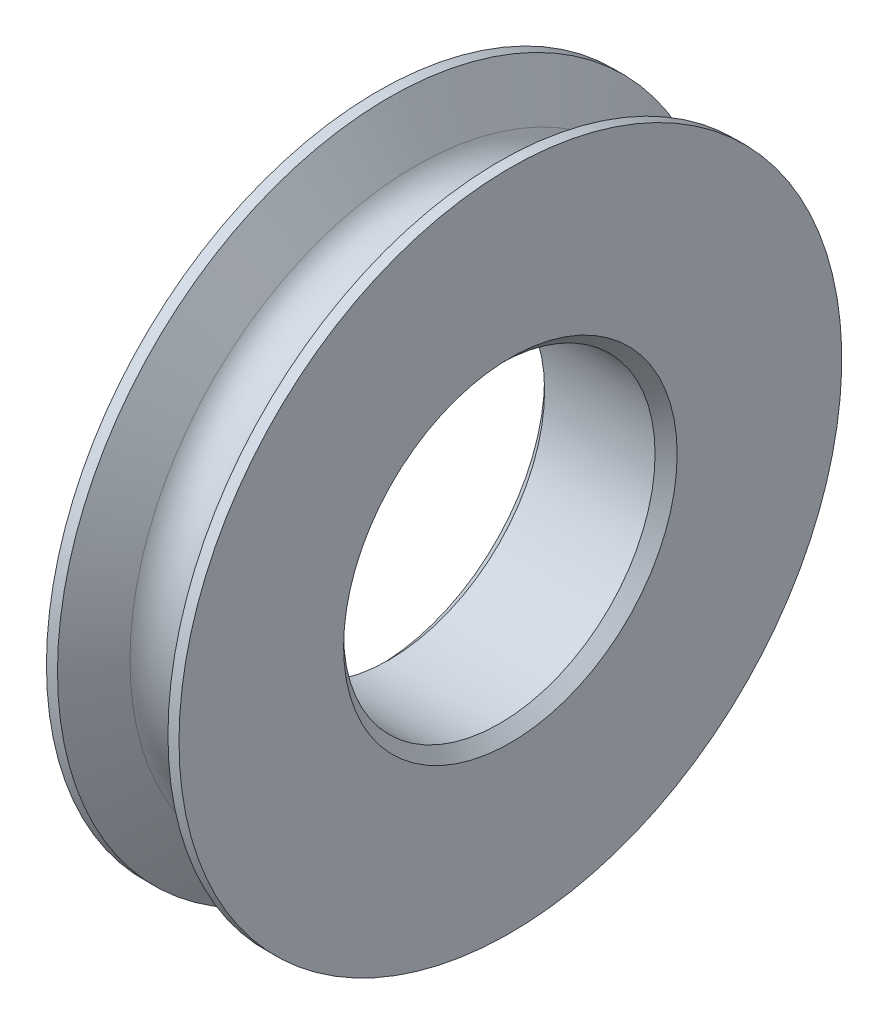
ISO-10303-21;
HEADER;
FILE_DESCRIPTION(('STEP AP214'),'2;1');
FILE_NAME('part.step','',(''),(''),'','','');
FILE_SCHEMA(('AUTOMOTIVE_DESIGN { 1 0 10303 214 1 1 1 1 }'));
ENDSEC;
DATA;
#1=APPLICATION_CONTEXT('core data for automotive mechanical design processes');
#2=APPLICATION_PROTOCOL_DEFINITION('international standard','automotive_design',2000,#1);
#3=PRODUCT_CONTEXT('',#1,'mechanical');
#4=PRODUCT('Part','Part','',(#3));
#5=PRODUCT_RELATED_PRODUCT_CATEGORY('part','',(#4));
#6=PRODUCT_DEFINITION_FORMATION('','',#4);
#7=PRODUCT_DEFINITION_CONTEXT('part definition',#1,'design');
#8=PRODUCT_DEFINITION('design','',#6,#7);
#9=PRODUCT_DEFINITION_SHAPE('','',#8);
#10=(LENGTH_UNIT() NAMED_UNIT(*) SI_UNIT(.MILLI.,.METRE.));
#11=(NAMED_UNIT(*) PLANE_ANGLE_UNIT() SI_UNIT($,.RADIAN.));
#12=(NAMED_UNIT(*) SI_UNIT($,.STERADIAN.) SOLID_ANGLE_UNIT());
#13=UNCERTAINTY_MEASURE_WITH_UNIT(LENGTH_MEASURE(1.E-05),#10,'distance_accuracy_value','');
#14=(GEOMETRIC_REPRESENTATION_CONTEXT(3) GLOBAL_UNCERTAINTY_ASSIGNED_CONTEXT((#13)) GLOBAL_UNIT_ASSIGNED_CONTEXT((#10,
#11,#12)) REPRESENTATION_CONTEXT('',''));
#15=CARTESIAN_POINT('',(0.,0.,0.));
#16=DIRECTION('',(0.,0.,1.));
#17=DIRECTION('',(1.,0.,0.));
#18=AXIS2_PLACEMENT_3D('',#15,#16,#17);
#19=CARTESIAN_POINT('',(3.,7.05,0.));
#20=DIRECTION('',(-1.,0.,0.));
#21=DIRECTION('',(0.,0.,1.));
#22=AXIS2_PLACEMENT_3D('',#19,#20,#21);
#23=PLANE('',#22);
#24=CARTESIAN_POINT('',(3.,0.,0.));
#25=DIRECTION('',(-1.,0.,0.));
#26=DIRECTION('',(0.,0.,1.));
#27=AXIS2_PLACEMENT_3D('',#24,#25,#26);
#28=CIRCLE('',#27,7.54999999999999);
#29=CARTESIAN_POINT('',(3.,0.,7.54999999999999));
#30=VERTEX_POINT('',#29);
#31=EDGE_CURVE('E57',#30,#30,#28,.T.);
#32=ORIENTED_EDGE('',*,*,#31,.T.);
#33=EDGE_LOOP('',(#32));
#34=FACE_BOUND('',#33,.T.);
#35=CARTESIAN_POINT('',(3.,0.,0.));
#36=DIRECTION('',(-1.,0.,0.));
#37=DIRECTION('',(0.,0.,1.));
#38=AXIS2_PLACEMENT_3D('',#35,#36,#37);
#39=CIRCLE('',#38,15.);
#40=CARTESIAN_POINT('',(3.,0.,15.));
#41=VERTEX_POINT('',#40);
#42=EDGE_CURVE('E62',#41,#41,#39,.T.);
#43=ORIENTED_EDGE('',*,*,#42,.F.);
#44=EDGE_LOOP('',(#43));
#45=FACE_BOUND('',#44,.T.);
#46=ADVANCED_FACE('F41',(#34,#45),#23,.F.);
#47=CARTESIAN_POINT('',(-10.2331083957926,0.,0.));
#48=DIRECTION('',(-1.,0.,0.));
#49=DIRECTION('',(0.,0.,1.));
#50=AXIS2_PLACEMENT_3D('',#47,#48,#49);
#51=CYLINDRICAL_SURFACE('',#50,15.);
#52=CARTESIAN_POINT('',(2.5,0.,0.));
#53=DIRECTION('',(-1.,0.,0.));
#54=DIRECTION('',(0.,0.,1.));
#55=AXIS2_PLACEMENT_3D('',#52,#53,#54);
#56=CIRCLE('',#55,15.);
#57=CARTESIAN_POINT('',(2.5,0.,15.));
#58=VERTEX_POINT('',#57);
#59=EDGE_CURVE('E65',#58,#58,#56,.T.);
#60=ORIENTED_EDGE('',*,*,#59,.F.);
#61=EDGE_LOOP('',(#60));
#62=FACE_BOUND('',#61,.T.);
#63=ORIENTED_EDGE('',*,*,#42,.T.);
#64=EDGE_LOOP('',(#63));
#65=FACE_BOUND('',#64,.T.);
#66=ADVANCED_FACE('F104',(#62,#65),#51,.T.);
#67=CARTESIAN_POINT('',(2.5,0.,0.));
#68=DIRECTION('',(1.,0.,0.));
#69=DIRECTION('',(0.,0.,-1.));
#70=AXIS2_PLACEMENT_3D('',#67,#68,#69);
#71=CONICAL_SURFACE('',#70,15.,1.0471975511966);
#72=CARTESIAN_POINT('',(1.29903810567666,0.,0.));
#73=DIRECTION('',(-1.,0.,0.));
#74=DIRECTION('',(0.,0.,1.));
#75=AXIS2_PLACEMENT_3D('',#72,#73,#74);
#76=CIRCLE('',#75,12.9198729810778);
#77=CARTESIAN_POINT('',(1.29903810567666,0.,12.9198729810778));
#78=VERTEX_POINT('',#77);
#79=EDGE_CURVE('E68',#78,#78,#76,.T.);
#80=ORIENTED_EDGE('',*,*,#79,.F.);
#81=EDGE_LOOP('',(#80));
#82=FACE_BOUND('',#81,.T.);
#83=ORIENTED_EDGE('',*,*,#59,.T.);
#84=EDGE_LOOP('',(#83));
#85=FACE_BOUND('',#84,.T.);
#86=ADVANCED_FACE('F98',(#82,#85),#71,.T.);
#87=CARTESIAN_POINT('',(0.,0.,0.));
#88=DIRECTION('',(-1.,0.,0.));
#89=DIRECTION('',(0.,0.,1.));
#90=AXIS2_PLACEMENT_3D('',#87,#88,#89);
#91=TOROIDAL_SURFACE('',#90,13.6698729810778,1.5);
#92=CARTESIAN_POINT('',(-1.29903810567666,0.,0.));
#93=DIRECTION('',(-1.,0.,0.));
#94=DIRECTION('',(0.,0.,1.));
#95=AXIS2_PLACEMENT_3D('',#92,#93,#94);
#96=CIRCLE('',#95,12.9198729810778);
#97=CARTESIAN_POINT('',(-1.29903810567666,0.,12.9198729810778));
#98=VERTEX_POINT('',#97);
#99=EDGE_CURVE('E71',#98,#98,#96,.T.);
#100=ORIENTED_EDGE('',*,*,#99,.F.);
#101=EDGE_LOOP('',(#100));
#102=FACE_BOUND('',#101,.T.);
#103=ORIENTED_EDGE('',*,*,#79,.T.);
#104=EDGE_LOOP('',(#103));
#105=FACE_BOUND('',#104,.T.);
#106=ADVANCED_FACE('F92',(#102,#105),#91,.F.);
#107=CARTESIAN_POINT('',(-1.29903810567666,0.,0.));
#108=DIRECTION('',(-1.,0.,0.));
#109=DIRECTION('',(0.,0.,1.));
#110=AXIS2_PLACEMENT_3D('',#107,#108,#109);
#111=CONICAL_SURFACE('',#110,12.9198729810778,1.0471975511966);
#112=CARTESIAN_POINT('',(-2.5,0.,0.));
#113=DIRECTION('',(-1.,0.,0.));
#114=DIRECTION('',(0.,0.,1.));
#115=AXIS2_PLACEMENT_3D('',#112,#113,#114);
#116=CIRCLE('',#115,15.);
#117=CARTESIAN_POINT('',(-2.5,0.,15.));
#118=VERTEX_POINT('',#117);
#119=EDGE_CURVE('E74',#118,#118,#116,.T.);
#120=ORIENTED_EDGE('',*,*,#119,.F.);
#121=EDGE_LOOP('',(#120));
#122=FACE_BOUND('',#121,.T.);
#123=ORIENTED_EDGE('',*,*,#99,.T.);
#124=EDGE_LOOP('',(#123));
#125=FACE_BOUND('',#124,.T.);
#126=ADVANCED_FACE('F86',(#122,#125),#111,.T.);
#127=CARTESIAN_POINT('',(-10.2331083957926,0.,0.));
#128=DIRECTION('',(-1.,0.,0.));
#129=DIRECTION('',(0.,0.,1.));
#130=AXIS2_PLACEMENT_3D('',#127,#128,#129);
#131=CYLINDRICAL_SURFACE('',#130,15.);
#132=CARTESIAN_POINT('',(-3.,0.,0.));
#133=DIRECTION('',(-1.,0.,0.));
#134=DIRECTION('',(0.,0.,1.));
#135=AXIS2_PLACEMENT_3D('',#132,#133,#134);
#136=CIRCLE('',#135,15.);
#137=CARTESIAN_POINT('',(-3.,0.,15.));
#138=VERTEX_POINT('',#137);
#139=EDGE_CURVE('E77',#138,#138,#136,.T.);
#140=ORIENTED_EDGE('',*,*,#139,.F.);
#141=EDGE_LOOP('',(#140));
#142=FACE_BOUND('',#141,.T.);
#143=ORIENTED_EDGE('',*,*,#119,.T.);
#144=EDGE_LOOP('',(#143));
#145=FACE_BOUND('',#144,.T.);
#146=ADVANCED_FACE('F83',(#142,#145),#131,.T.);
#147=CARTESIAN_POINT('',(-3.,7.05,0.));
#148=DIRECTION('',(1.,0.,0.));
#149=DIRECTION('',(0.,0.,-1.));
#150=AXIS2_PLACEMENT_3D('',#147,#148,#149);
#151=PLANE('',#150);
#152=CARTESIAN_POINT('',(-3.,0.,0.));
#153=DIRECTION('',(1.,0.,0.));
#154=DIRECTION('',(0.,0.,-1.));
#155=AXIS2_PLACEMENT_3D('',#152,#153,#154);
#156=CIRCLE('',#155,7.55);
#157=CARTESIAN_POINT('',(-3.,0.,-7.55));
#158=VERTEX_POINT('',#157);
#159=EDGE_CURVE('E10',#158,#158,#156,.T.);
#160=ORIENTED_EDGE('',*,*,#159,.T.);
#161=EDGE_LOOP('',(#160));
#162=FACE_BOUND('',#161,.T.);
#163=ORIENTED_EDGE('',*,*,#139,.T.);
#164=EDGE_LOOP('',(#163));
#165=FACE_BOUND('',#164,.T.);
#166=ADVANCED_FACE('F81',(#162,#165),#151,.F.);
#167=CARTESIAN_POINT('',(-10.2331083957926,0.,0.));
#168=DIRECTION('',(-1.,0.,0.));
#169=DIRECTION('',(0.,0.,1.));
#170=AXIS2_PLACEMENT_3D('',#167,#168,#169);
#171=CYLINDRICAL_SURFACE('',#170,7.05);
#172=CARTESIAN_POINT('',(2.50000000000001,0.,0.));
#173=DIRECTION('',(-1.,0.,0.));
#174=DIRECTION('',(0.,0.,1.));
#175=AXIS2_PLACEMENT_3D('',#172,#173,#174);
#176=CIRCLE('',#175,7.05);
#177=CARTESIAN_POINT('',(2.50000000000001,0.,7.05));
#178=VERTEX_POINT('',#177);
#179=EDGE_CURVE('E49',#178,#178,#176,.F.);
#180=ORIENTED_EDGE('',*,*,#179,.T.);
#181=EDGE_LOOP('',(#180));
#182=FACE_BOUND('',#181,.T.);
#183=CARTESIAN_POINT('',(-2.5,0.,0.));
#184=DIRECTION('',(1.,0.,0.));
#185=DIRECTION('',(0.,0.,-1.));
#186=AXIS2_PLACEMENT_3D('',#183,#184,#185);
#187=CIRCLE('',#186,7.05);
#188=CARTESIAN_POINT('',(-2.5,0.,-7.05));
#189=VERTEX_POINT('',#188);
#190=EDGE_CURVE('E53',#189,#189,#187,.F.);
#191=ORIENTED_EDGE('',*,*,#190,.T.);
#192=EDGE_LOOP('',(#191));
#193=FACE_BOUND('',#192,.T.);
#194=ADVANCED_FACE('F123',(#182,#193),#171,.F.);
#195=CARTESIAN_POINT('',(3.,0.,0.));
#196=DIRECTION('',(1.,0.,0.));
#197=DIRECTION('',(0.,0.,-1.));
#198=AXIS2_PLACEMENT_3D('',#195,#196,#197);
#199=CONICAL_SURFACE('',#198,7.54999999999999,0.785398163397448);
#200=ORIENTED_EDGE('',*,*,#179,.F.);
#201=EDGE_LOOP('',(#200));
#202=FACE_BOUND('',#201,.T.);
#203=ORIENTED_EDGE('',*,*,#31,.F.);
#204=EDGE_LOOP('',(#203));
#205=FACE_BOUND('',#204,.T.);
#206=ADVANCED_FACE('F119',(#202,#205),#199,.F.);
#207=CARTESIAN_POINT('',(-2.5,0.,0.));
#208=DIRECTION('',(-1.,0.,0.));
#209=DIRECTION('',(0.,0.,1.));
#210=AXIS2_PLACEMENT_3D('',#207,#208,#209);
#211=CONICAL_SURFACE('',#210,7.05,0.785398163397452);
#212=ORIENTED_EDGE('',*,*,#159,.F.);
#213=EDGE_LOOP('',(#212));
#214=FACE_BOUND('',#213,.T.);
#215=ORIENTED_EDGE('',*,*,#190,.F.);
#216=EDGE_LOOP('',(#215));
#217=FACE_BOUND('',#216,.T.);
#218=ADVANCED_FACE('F44',(#214,#217),#211,.F.);
#219=CLOSED_SHELL('',(#46,#66,#86,#106,#126,#146,#166,#194,#206,#218));
#220=MANIFOLD_SOLID_BREP('B2',#219);
#221=ADVANCED_BREP_SHAPE_REPRESENTATION('',(#18,#220),#14);
#222=SHAPE_DEFINITION_REPRESENTATION(#9,#221);
ENDSEC;
END-ISO-10303-21;
